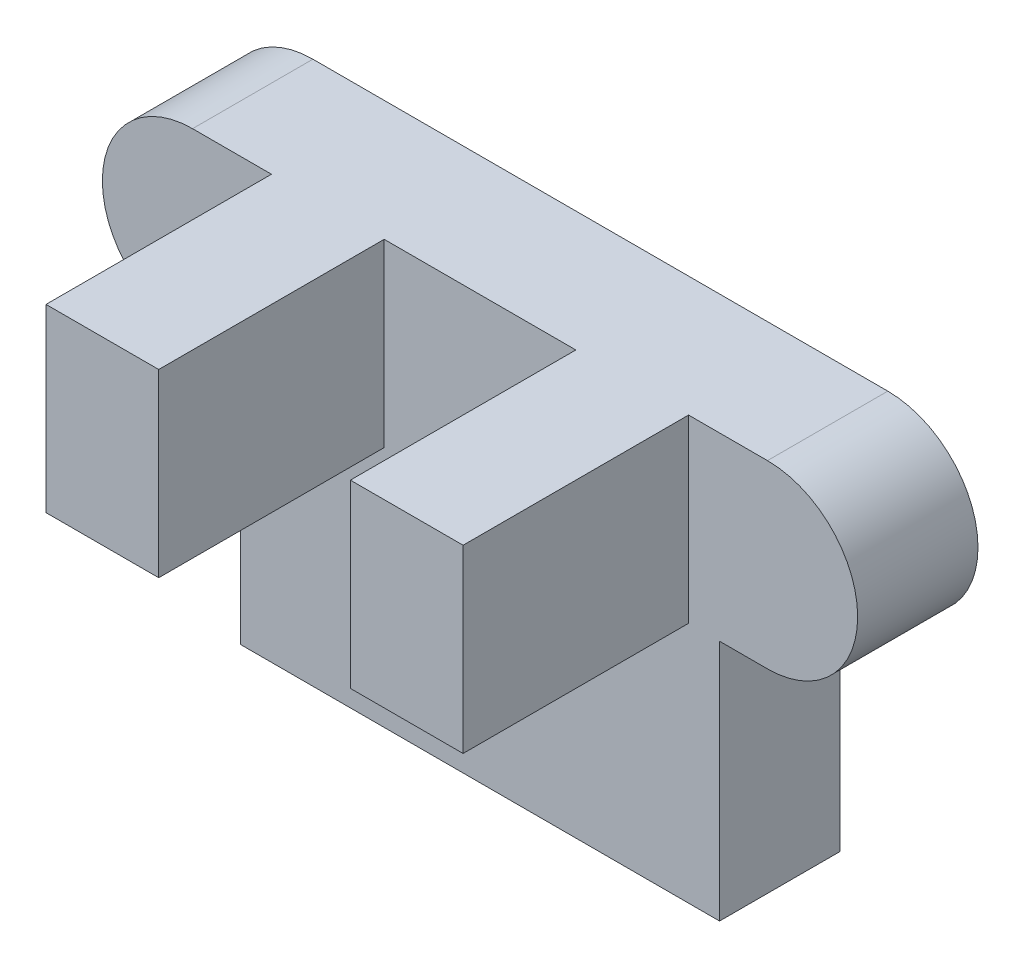
ISO-10303-21;
HEADER;
FILE_DESCRIPTION(('STEP AP214'),'2;1');
FILE_NAME('part.step','',(''),(''),'','','');
FILE_SCHEMA(('AUTOMOTIVE_DESIGN { 1 0 10303 214 1 1 1 1 }'));
ENDSEC;
DATA;
#1=APPLICATION_CONTEXT('core data for automotive mechanical design processes');
#2=APPLICATION_PROTOCOL_DEFINITION('international standard','automotive_design',2000,#1);
#3=PRODUCT_CONTEXT('',#1,'mechanical');
#4=PRODUCT('Part','Part','',(#3));
#5=PRODUCT_RELATED_PRODUCT_CATEGORY('part','',(#4));
#6=PRODUCT_DEFINITION_FORMATION('','',#4);
#7=PRODUCT_DEFINITION_CONTEXT('part definition',#1,'design');
#8=PRODUCT_DEFINITION('design','',#6,#7);
#9=PRODUCT_DEFINITION_SHAPE('','',#8);
#10=(LENGTH_UNIT() NAMED_UNIT(*) SI_UNIT(.MILLI.,.METRE.));
#11=(NAMED_UNIT(*) PLANE_ANGLE_UNIT() SI_UNIT($,.RADIAN.));
#12=(NAMED_UNIT(*) SI_UNIT($,.STERADIAN.) SOLID_ANGLE_UNIT());
#13=UNCERTAINTY_MEASURE_WITH_UNIT(LENGTH_MEASURE(1.E-05),#10,'distance_accuracy_value','');
#14=(GEOMETRIC_REPRESENTATION_CONTEXT(3) GLOBAL_UNCERTAINTY_ASSIGNED_CONTEXT((#13)) GLOBAL_UNIT_ASSIGNED_CONTEXT((#10,
#11,#12)) REPRESENTATION_CONTEXT('',''));
#15=CARTESIAN_POINT('',(0.,0.,0.));
#16=DIRECTION('',(0.,0.,1.));
#17=DIRECTION('',(1.,0.,0.));
#18=AXIS2_PLACEMENT_3D('',#15,#16,#17);
#19=CARTESIAN_POINT('',(0.,0.,4.27));
#20=DIRECTION('',(0.,0.,1.));
#21=DIRECTION('',(1.,0.,0.));
#22=AXIS2_PLACEMENT_3D('',#19,#20,#21);
#23=PLANE('',#22);
#24=DIRECTION('',(-1.,0.,0.));
#25=VECTOR('',#24,1.);
#26=CARTESIAN_POINT('',(0.,3.2,4.27));
#27=LINE('',#26,#25);
#28=CARTESIAN_POINT('',(20.4,3.2,4.27));
#29=VERTEX_POINT('',#28);
#30=CARTESIAN_POINT('',(17.6,3.2,4.27));
#31=VERTEX_POINT('',#30);
#32=EDGE_CURVE('E225',#29,#31,#27,.T.);
#33=ORIENTED_EDGE('',*,*,#32,.T.);
#34=DIRECTION('',(0.,1.,0.));
#35=VECTOR('',#34,1.);
#36=CARTESIAN_POINT('',(17.6,3.2,4.27));
#37=LINE('',#36,#35);
#38=CARTESIAN_POINT('',(17.6,-3.19999999999999,4.27));
#39=VERTEX_POINT('',#38);
#40=EDGE_CURVE('E174',#39,#31,#37,.T.);
#41=ORIENTED_EDGE('',*,*,#40,.F.);
#42=DIRECTION('',(1.,0.,0.));
#43=VECTOR('',#42,1.);
#44=CARTESIAN_POINT('',(17.6,-3.19999999999999,4.27));
#45=LINE('',#44,#43);
#46=CARTESIAN_POINT('',(13.6,-3.2,4.27));
#47=VERTEX_POINT('',#46);
#48=EDGE_CURVE('E170',#47,#39,#45,.T.);
#49=ORIENTED_EDGE('',*,*,#48,.F.);
#50=DIRECTION('',(0.,-1.,0.));
#51=VECTOR('',#50,1.);
#52=CARTESIAN_POINT('',(13.6,3.2,4.27));
#53=LINE('',#52,#51);
#54=CARTESIAN_POINT('',(13.6,3.2,4.27));
#55=VERTEX_POINT('',#54);
#56=EDGE_CURVE('E460',#55,#47,#53,.T.);
#57=ORIENTED_EDGE('',*,*,#56,.F.);
#58=CARTESIAN_POINT('',(6.8,3.2,4.27));
#59=VERTEX_POINT('',#58);
#60=EDGE_CURVE('E228',#55,#59,#27,.T.);
#61=ORIENTED_EDGE('',*,*,#60,.T.);
#62=DIRECTION('',(0.,1.,0.));
#63=VECTOR('',#62,1.);
#64=CARTESIAN_POINT('',(6.8,3.2,4.27));
#65=LINE('',#64,#63);
#66=CARTESIAN_POINT('',(6.8,-3.2,4.27));
#67=VERTEX_POINT('',#66);
#68=EDGE_CURVE('E187',#67,#59,#65,.T.);
#69=ORIENTED_EDGE('',*,*,#68,.F.);
#70=DIRECTION('',(1.,0.,0.));
#71=VECTOR('',#70,1.);
#72=CARTESIAN_POINT('',(2.8,-3.2,4.27));
#73=LINE('',#72,#71);
#74=CARTESIAN_POINT('',(2.8,-3.2,4.27));
#75=VERTEX_POINT('',#74);
#76=EDGE_CURVE('E60',#75,#67,#73,.T.);
#77=ORIENTED_EDGE('',*,*,#76,.F.);
#78=DIRECTION('',(0.,-1.,0.));
#79=VECTOR('',#78,1.);
#80=CARTESIAN_POINT('',(2.8,3.2,4.27));
#81=LINE('',#80,#79);
#82=CARTESIAN_POINT('',(2.8,3.2,4.27));
#83=VERTEX_POINT('',#82);
#84=EDGE_CURVE('E176',#83,#75,#81,.T.);
#85=ORIENTED_EDGE('',*,*,#84,.F.);
#86=CARTESIAN_POINT('',(0.,3.2,4.27));
#87=VERTEX_POINT('',#86);
#88=EDGE_CURVE('E224',#83,#87,#27,.T.);
#89=ORIENTED_EDGE('',*,*,#88,.T.);
#90=CARTESIAN_POINT('',(0.,0.,4.27));
#91=DIRECTION('',(0.,0.,1.));
#92=DIRECTION('',(1.,0.,0.));
#93=AXIS2_PLACEMENT_3D('',#90,#91,#92);
#94=CIRCLE('',#93,3.2);
#95=CARTESIAN_POINT('',(0.,-3.2,4.27));
#96=VERTEX_POINT('',#95);
#97=EDGE_CURVE('E208',#87,#96,#94,.T.);
#98=ORIENTED_EDGE('',*,*,#97,.T.);
#99=DIRECTION('',(1.,0.,0.));
#100=VECTOR('',#99,1.);
#101=CARTESIAN_POINT('',(0.,-3.2,4.27));
#102=LINE('',#101,#100);
#103=CARTESIAN_POINT('',(1.7,-3.2,4.27));
#104=VERTEX_POINT('',#103);
#105=EDGE_CURVE('E211',#96,#104,#102,.T.);
#106=ORIENTED_EDGE('',*,*,#105,.T.);
#107=DIRECTION('',(0.,-1.,0.));
#108=VECTOR('',#107,1.);
#109=CARTESIAN_POINT('',(1.7,-3.2,4.27));
#110=LINE('',#109,#108);
#111=CARTESIAN_POINT('',(1.7,-11.8,4.27));
#112=VERTEX_POINT('',#111);
#113=EDGE_CURVE('E214',#104,#112,#110,.T.);
#114=ORIENTED_EDGE('',*,*,#113,.T.);
#115=DIRECTION('',(1.,0.,0.));
#116=VECTOR('',#115,1.);
#117=CARTESIAN_POINT('',(1.7,-11.8,4.27));
#118=LINE('',#117,#116);
#119=CARTESIAN_POINT('',(18.7,-11.8,4.27));
#120=VERTEX_POINT('',#119);
#121=EDGE_CURVE('E216',#112,#120,#118,.T.);
#122=ORIENTED_EDGE('',*,*,#121,.T.);
#123=DIRECTION('',(0.,1.,0.));
#124=VECTOR('',#123,1.);
#125=CARTESIAN_POINT('',(18.7,-3.2,4.27));
#126=LINE('',#125,#124);
#127=CARTESIAN_POINT('',(18.7,-3.2,4.27));
#128=VERTEX_POINT('',#127);
#129=EDGE_CURVE('E218',#120,#128,#126,.T.);
#130=ORIENTED_EDGE('',*,*,#129,.T.);
#131=DIRECTION('',(1.,0.,0.));
#132=VECTOR('',#131,1.);
#133=CARTESIAN_POINT('',(18.7,-3.2,4.27));
#134=LINE('',#133,#132);
#135=CARTESIAN_POINT('',(20.4,-3.2,4.27));
#136=VERTEX_POINT('',#135);
#137=EDGE_CURVE('E220',#128,#136,#134,.T.);
#138=ORIENTED_EDGE('',*,*,#137,.T.);
#139=CARTESIAN_POINT('',(20.4,0.,4.27));
#140=DIRECTION('',(0.,0.,1.));
#141=DIRECTION('',(1.,0.,0.));
#142=AXIS2_PLACEMENT_3D('',#139,#140,#141);
#143=CIRCLE('',#142,3.2);
#144=EDGE_CURVE('E222',#136,#29,#143,.T.);
#145=ORIENTED_EDGE('',*,*,#144,.T.);
#146=EDGE_LOOP('',(#33,#41,#49,#57,#61,#69,#77,#85,#89,#98,#106,#114,#122,#130,#138,#145));
#147=FACE_BOUND('',#146,.T.);
#148=ADVANCED_FACE('F37',(#147),#23,.T.);
#149=CARTESIAN_POINT('',(0.,0.,4.27));
#150=DIRECTION('',(0.,0.,-1.));
#151=DIRECTION('',(-1.,0.,0.));
#152=AXIS2_PLACEMENT_3D('',#149,#150,#151);
#153=CYLINDRICAL_SURFACE('',#152,3.2);
#154=CARTESIAN_POINT('',(0.,0.,0.));
#155=DIRECTION('',(0.,0.,1.));
#156=DIRECTION('',(1.,0.,0.));
#157=AXIS2_PLACEMENT_3D('',#154,#155,#156);
#158=CIRCLE('',#157,3.2);
#159=CARTESIAN_POINT('',(0.,3.2,0.));
#160=VERTEX_POINT('',#159);
#161=CARTESIAN_POINT('',(0.,-3.2,0.));
#162=VERTEX_POINT('',#161);
#163=EDGE_CURVE('E207',#160,#162,#158,.T.);
#164=ORIENTED_EDGE('',*,*,#163,.T.);
#165=DIRECTION('',(0.,0.,-1.));
#166=VECTOR('',#165,1.);
#167=CARTESIAN_POINT('',(0.,-3.2,4.27));
#168=LINE('',#167,#166);
#169=EDGE_CURVE('E11',#96,#162,#168,.T.);
#170=ORIENTED_EDGE('',*,*,#169,.F.);
#171=ORIENTED_EDGE('',*,*,#97,.F.);
#172=DIRECTION('',(0.,0.,-1.));
#173=VECTOR('',#172,1.);
#174=CARTESIAN_POINT('',(0.,3.2,4.27));
#175=LINE('',#174,#173);
#176=EDGE_CURVE('E227',#87,#160,#175,.T.);
#177=ORIENTED_EDGE('',*,*,#176,.T.);
#178=EDGE_LOOP('',(#164,#170,#171,#177));
#179=FACE_BOUND('',#178,.T.);
#180=ADVANCED_FACE('F39',(#179),#153,.T.);
#181=CARTESIAN_POINT('',(0.,-3.2,4.27));
#182=DIRECTION('',(0.,1.,0.));
#183=DIRECTION('',(-1.,0.,0.));
#184=AXIS2_PLACEMENT_3D('',#181,#182,#183);
#185=PLANE('',#184);
#186=DIRECTION('',(1.,0.,0.));
#187=VECTOR('',#186,1.);
#188=CARTESIAN_POINT('',(0.,-3.2,0.));
#189=LINE('',#188,#187);
#190=CARTESIAN_POINT('',(1.7,-3.2,0.));
#191=VERTEX_POINT('',#190);
#192=EDGE_CURVE('E231',#162,#191,#189,.T.);
#193=ORIENTED_EDGE('',*,*,#192,.T.);
#194=DIRECTION('',(0.,0.,-1.));
#195=VECTOR('',#194,1.);
#196=CARTESIAN_POINT('',(1.7,-3.2,4.27));
#197=LINE('',#196,#195);
#198=EDGE_CURVE('E45',#104,#191,#197,.T.);
#199=ORIENTED_EDGE('',*,*,#198,.F.);
#200=ORIENTED_EDGE('',*,*,#105,.F.);
#201=ORIENTED_EDGE('',*,*,#169,.T.);
#202=EDGE_LOOP('',(#193,#199,#200,#201));
#203=FACE_BOUND('',#202,.T.);
#204=ADVANCED_FACE('F286',(#203),#185,.F.);
#205=CARTESIAN_POINT('',(1.7,-3.2,4.27));
#206=DIRECTION('',(1.,0.,0.));
#207=DIRECTION('',(0.,1.,0.));
#208=AXIS2_PLACEMENT_3D('',#205,#206,#207);
#209=PLANE('',#208);
#210=DIRECTION('',(0.,-1.,0.));
#211=VECTOR('',#210,1.);
#212=CARTESIAN_POINT('',(1.7,-3.2,0.));
#213=LINE('',#212,#211);
#214=CARTESIAN_POINT('',(1.7,-11.8,0.));
#215=VERTEX_POINT('',#214);
#216=EDGE_CURVE('E233',#191,#215,#213,.T.);
#217=ORIENTED_EDGE('',*,*,#216,.T.);
#218=DIRECTION('',(0.,0.,-1.));
#219=VECTOR('',#218,1.);
#220=CARTESIAN_POINT('',(1.7,-11.8,4.27));
#221=LINE('',#220,#219);
#222=EDGE_CURVE('E258',#112,#215,#221,.T.);
#223=ORIENTED_EDGE('',*,*,#222,.F.);
#224=ORIENTED_EDGE('',*,*,#113,.F.);
#225=ORIENTED_EDGE('',*,*,#198,.T.);
#226=EDGE_LOOP('',(#217,#223,#224,#225));
#227=FACE_BOUND('',#226,.T.);
#228=ADVANCED_FACE('F265',(#227),#209,.F.);
#229=CARTESIAN_POINT('',(1.7,-11.8,4.27));
#230=DIRECTION('',(0.,1.,0.));
#231=DIRECTION('',(-1.,0.,0.));
#232=AXIS2_PLACEMENT_3D('',#229,#230,#231);
#233=PLANE('',#232);
#234=DIRECTION('',(1.,0.,0.));
#235=VECTOR('',#234,1.);
#236=CARTESIAN_POINT('',(1.7,-11.8,0.));
#237=LINE('',#236,#235);
#238=CARTESIAN_POINT('',(18.7,-11.8,0.));
#239=VERTEX_POINT('',#238);
#240=EDGE_CURVE('E235',#215,#239,#237,.T.);
#241=ORIENTED_EDGE('',*,*,#240,.T.);
#242=DIRECTION('',(0.,0.,-1.));
#243=VECTOR('',#242,1.);
#244=CARTESIAN_POINT('',(18.7,-11.8,4.27));
#245=LINE('',#244,#243);
#246=EDGE_CURVE('E255',#120,#239,#245,.T.);
#247=ORIENTED_EDGE('',*,*,#246,.F.);
#248=ORIENTED_EDGE('',*,*,#121,.F.);
#249=ORIENTED_EDGE('',*,*,#222,.T.);
#250=EDGE_LOOP('',(#241,#247,#248,#249));
#251=FACE_BOUND('',#250,.T.);
#252=ADVANCED_FACE('F276',(#251),#233,.F.);
#253=CARTESIAN_POINT('',(18.7,-3.2,4.27));
#254=DIRECTION('',(-1.,0.,0.));
#255=DIRECTION('',(0.,-1.,0.));
#256=AXIS2_PLACEMENT_3D('',#253,#254,#255);
#257=PLANE('',#256);
#258=DIRECTION('',(0.,1.,0.));
#259=VECTOR('',#258,1.);
#260=CARTESIAN_POINT('',(18.7,-3.2,0.));
#261=LINE('',#260,#259);
#262=CARTESIAN_POINT('',(18.7,-3.2,0.));
#263=VERTEX_POINT('',#262);
#264=EDGE_CURVE('E237',#239,#263,#261,.T.);
#265=ORIENTED_EDGE('',*,*,#264,.T.);
#266=DIRECTION('',(0.,0.,-1.));
#267=VECTOR('',#266,1.);
#268=CARTESIAN_POINT('',(18.7,-3.2,4.27));
#269=LINE('',#268,#267);
#270=EDGE_CURVE('E252',#128,#263,#269,.T.);
#271=ORIENTED_EDGE('',*,*,#270,.F.);
#272=ORIENTED_EDGE('',*,*,#129,.F.);
#273=ORIENTED_EDGE('',*,*,#246,.T.);
#274=EDGE_LOOP('',(#265,#271,#272,#273));
#275=FACE_BOUND('',#274,.T.);
#276=ADVANCED_FACE('F280',(#275),#257,.F.);
#277=CARTESIAN_POINT('',(18.7,-3.2,4.27));
#278=DIRECTION('',(0.,1.,0.));
#279=DIRECTION('',(0.,0.,1.));
#280=AXIS2_PLACEMENT_3D('',#277,#278,#279);
#281=PLANE('',#280);
#282=DIRECTION('',(1.,0.,0.));
#283=VECTOR('',#282,1.);
#284=CARTESIAN_POINT('',(18.7,-3.2,0.));
#285=LINE('',#284,#283);
#286=CARTESIAN_POINT('',(20.4,-3.2,0.));
#287=VERTEX_POINT('',#286);
#288=EDGE_CURVE('E239',#263,#287,#285,.T.);
#289=ORIENTED_EDGE('',*,*,#288,.T.);
#290=DIRECTION('',(0.,0.,-1.));
#291=VECTOR('',#290,1.);
#292=CARTESIAN_POINT('',(20.4,-3.2,4.27));
#293=LINE('',#292,#291);
#294=EDGE_CURVE('E249',#136,#287,#293,.T.);
#295=ORIENTED_EDGE('',*,*,#294,.F.);
#296=ORIENTED_EDGE('',*,*,#137,.F.);
#297=ORIENTED_EDGE('',*,*,#270,.T.);
#298=EDGE_LOOP('',(#289,#295,#296,#297));
#299=FACE_BOUND('',#298,.T.);
#300=ADVANCED_FACE('F297',(#299),#281,.F.);
#301=CARTESIAN_POINT('',(20.4,0.,4.27));
#302=DIRECTION('',(0.,0.,-1.));
#303=DIRECTION('',(-1.,0.,0.));
#304=AXIS2_PLACEMENT_3D('',#301,#302,#303);
#305=CYLINDRICAL_SURFACE('',#304,3.2);
#306=CARTESIAN_POINT('',(20.4,0.,0.));
#307=DIRECTION('',(0.,0.,1.));
#308=DIRECTION('',(1.,0.,0.));
#309=AXIS2_PLACEMENT_3D('',#306,#307,#308);
#310=CIRCLE('',#309,3.2);
#311=CARTESIAN_POINT('',(20.4,3.2,0.));
#312=VERTEX_POINT('',#311);
#313=EDGE_CURVE('E241',#287,#312,#310,.T.);
#314=ORIENTED_EDGE('',*,*,#313,.T.);
#315=DIRECTION('',(0.,0.,-1.));
#316=VECTOR('',#315,1.);
#317=CARTESIAN_POINT('',(20.4,3.2,4.27));
#318=LINE('',#317,#316);
#319=EDGE_CURVE('E246',#29,#312,#318,.T.);
#320=ORIENTED_EDGE('',*,*,#319,.F.);
#321=ORIENTED_EDGE('',*,*,#144,.F.);
#322=ORIENTED_EDGE('',*,*,#294,.T.);
#323=EDGE_LOOP('',(#314,#320,#321,#322));
#324=FACE_BOUND('',#323,.T.);
#325=ADVANCED_FACE('F295',(#324),#305,.T.);
#326=CARTESIAN_POINT('',(0.,3.2,4.27));
#327=DIRECTION('',(0.,-1.,0.));
#328=DIRECTION('',(0.,0.,-1.));
#329=AXIS2_PLACEMENT_3D('',#326,#327,#328);
#330=PLANE('',#329);
#331=DIRECTION('',(-1.,0.,0.));
#332=VECTOR('',#331,1.);
#333=CARTESIAN_POINT('',(0.,3.2,0.));
#334=LINE('',#333,#332);
#335=EDGE_CURVE('E212',#312,#160,#334,.T.);
#336=ORIENTED_EDGE('',*,*,#335,.T.);
#337=ORIENTED_EDGE('',*,*,#176,.F.);
#338=ORIENTED_EDGE('',*,*,#88,.F.);
#339=DIRECTION('',(0.,0.,-1.));
#340=VECTOR('',#339,1.);
#341=CARTESIAN_POINT('',(2.8,3.2,12.27));
#342=LINE('',#341,#340);
#343=CARTESIAN_POINT('',(2.8,3.2,12.27));
#344=VERTEX_POINT('',#343);
#345=EDGE_CURVE('E192',#344,#83,#342,.T.);
#346=ORIENTED_EDGE('',*,*,#345,.F.);
#347=DIRECTION('',(-1.,0.,0.));
#348=VECTOR('',#347,1.);
#349=CARTESIAN_POINT('',(2.8,3.2,12.27));
#350=LINE('',#349,#348);
#351=CARTESIAN_POINT('',(6.8,3.2,12.27));
#352=VERTEX_POINT('',#351);
#353=EDGE_CURVE('E191',#352,#344,#350,.T.);
#354=ORIENTED_EDGE('',*,*,#353,.F.);
#355=DIRECTION('',(0.,0.,-1.));
#356=VECTOR('',#355,1.);
#357=CARTESIAN_POINT('',(6.8,3.2,12.27));
#358=LINE('',#357,#356);
#359=EDGE_CURVE('E199',#352,#59,#358,.T.);
#360=ORIENTED_EDGE('',*,*,#359,.T.);
#361=ORIENTED_EDGE('',*,*,#60,.F.);
#362=DIRECTION('',(0.,0.,-1.));
#363=VECTOR('',#362,1.);
#364=CARTESIAN_POINT('',(13.6,3.2,12.27));
#365=LINE('',#364,#363);
#366=CARTESIAN_POINT('',(13.6,3.2,12.27));
#367=VERTEX_POINT('',#366);
#368=EDGE_CURVE('E158',#367,#55,#365,.T.);
#369=ORIENTED_EDGE('',*,*,#368,.F.);
#370=DIRECTION('',(-1.,0.,0.));
#371=VECTOR('',#370,1.);
#372=CARTESIAN_POINT('',(17.6,3.2,12.27));
#373=LINE('',#372,#371);
#374=CARTESIAN_POINT('',(17.6,3.2,12.27));
#375=VERTEX_POINT('',#374);
#376=EDGE_CURVE('E150',#375,#367,#373,.T.);
#377=ORIENTED_EDGE('',*,*,#376,.F.);
#378=DIRECTION('',(0.,0.,-1.));
#379=VECTOR('',#378,1.);
#380=CARTESIAN_POINT('',(17.6,3.2,12.27));
#381=LINE('',#380,#379);
#382=EDGE_CURVE('E155',#375,#31,#381,.T.);
#383=ORIENTED_EDGE('',*,*,#382,.T.);
#384=ORIENTED_EDGE('',*,*,#32,.F.);
#385=ORIENTED_EDGE('',*,*,#319,.T.);
#386=EDGE_LOOP('',(#336,#337,#338,#346,#354,#360,#361,#369,#377,#383,#384,#385));
#387=FACE_BOUND('',#386,.T.);
#388=ADVANCED_FACE('F152',(#387),#330,.F.);
#389=CARTESIAN_POINT('',(0.,0.,0.));
#390=DIRECTION('',(0.,0.,1.));
#391=DIRECTION('',(1.,0.,0.));
#392=AXIS2_PLACEMENT_3D('',#389,#390,#391);
#393=PLANE('',#392);
#394=ORIENTED_EDGE('',*,*,#163,.F.);
#395=ORIENTED_EDGE('',*,*,#335,.F.);
#396=ORIENTED_EDGE('',*,*,#313,.F.);
#397=ORIENTED_EDGE('',*,*,#288,.F.);
#398=ORIENTED_EDGE('',*,*,#264,.F.);
#399=ORIENTED_EDGE('',*,*,#240,.F.);
#400=ORIENTED_EDGE('',*,*,#216,.F.);
#401=ORIENTED_EDGE('',*,*,#192,.F.);
#402=EDGE_LOOP('',(#394,#395,#396,#397,#398,#399,#400,#401));
#403=FACE_BOUND('',#402,.T.);
#404=ADVANCED_FACE('F271',(#403),#393,.F.);
#405=CARTESIAN_POINT('',(2.8,3.2,12.27));
#406=DIRECTION('',(1.,0.,0.));
#407=DIRECTION('',(0.,1.,0.));
#408=AXIS2_PLACEMENT_3D('',#405,#406,#407);
#409=PLANE('',#408);
#410=ORIENTED_EDGE('',*,*,#84,.T.);
#411=DIRECTION('',(0.,0.,-1.));
#412=VECTOR('',#411,1.);
#413=CARTESIAN_POINT('',(2.8,-3.2,12.27));
#414=LINE('',#413,#412);
#415=CARTESIAN_POINT('',(2.8,-3.2,12.27));
#416=VERTEX_POINT('',#415);
#417=EDGE_CURVE('E205',#416,#75,#414,.T.);
#418=ORIENTED_EDGE('',*,*,#417,.F.);
#419=DIRECTION('',(0.,-1.,0.));
#420=VECTOR('',#419,1.);
#421=CARTESIAN_POINT('',(2.8,3.2,12.27));
#422=LINE('',#421,#420);
#423=EDGE_CURVE('E183',#344,#416,#422,.T.);
#424=ORIENTED_EDGE('',*,*,#423,.F.);
#425=ORIENTED_EDGE('',*,*,#345,.T.);
#426=EDGE_LOOP('',(#410,#418,#424,#425));
#427=FACE_BOUND('',#426,.T.);
#428=ADVANCED_FACE('F313',(#427),#409,.F.);
#429=CARTESIAN_POINT('',(2.8,-3.2,12.27));
#430=DIRECTION('',(0.,1.,0.));
#431=DIRECTION('',(0.,0.,1.));
#432=AXIS2_PLACEMENT_3D('',#429,#430,#431);
#433=PLANE('',#432);
#434=ORIENTED_EDGE('',*,*,#76,.T.);
#435=DIRECTION('',(0.,0.,-1.));
#436=VECTOR('',#435,1.);
#437=CARTESIAN_POINT('',(6.8,-3.2,12.27));
#438=LINE('',#437,#436);
#439=CARTESIAN_POINT('',(6.8,-3.2,12.27));
#440=VERTEX_POINT('',#439);
#441=EDGE_CURVE('E202',#440,#67,#438,.T.);
#442=ORIENTED_EDGE('',*,*,#441,.F.);
#443=DIRECTION('',(1.,0.,0.));
#444=VECTOR('',#443,1.);
#445=CARTESIAN_POINT('',(2.8,-3.2,12.27));
#446=LINE('',#445,#444);
#447=EDGE_CURVE('E186',#416,#440,#446,.T.);
#448=ORIENTED_EDGE('',*,*,#447,.F.);
#449=ORIENTED_EDGE('',*,*,#417,.T.);
#450=EDGE_LOOP('',(#434,#442,#448,#449));
#451=FACE_BOUND('',#450,.T.);
#452=ADVANCED_FACE('F332',(#451),#433,.F.);
#453=CARTESIAN_POINT('',(6.8,3.2,12.27));
#454=DIRECTION('',(-1.,0.,0.));
#455=DIRECTION('',(0.,0.,1.));
#456=AXIS2_PLACEMENT_3D('',#453,#454,#455);
#457=PLANE('',#456);
#458=ORIENTED_EDGE('',*,*,#68,.T.);
#459=ORIENTED_EDGE('',*,*,#359,.F.);
#460=DIRECTION('',(0.,1.,0.));
#461=VECTOR('',#460,1.);
#462=CARTESIAN_POINT('',(6.8,3.2,12.27));
#463=LINE('',#462,#461);
#464=EDGE_CURVE('E189',#440,#352,#463,.T.);
#465=ORIENTED_EDGE('',*,*,#464,.F.);
#466=ORIENTED_EDGE('',*,*,#441,.T.);
#467=EDGE_LOOP('',(#458,#459,#465,#466));
#468=FACE_BOUND('',#467,.T.);
#469=ADVANCED_FACE('F339',(#468),#457,.F.);
#470=CARTESIAN_POINT('',(0.,0.,12.27));
#471=DIRECTION('',(0.,0.,1.));
#472=DIRECTION('',(1.,0.,0.));
#473=AXIS2_PLACEMENT_3D('',#470,#471,#472);
#474=PLANE('',#473);
#475=ORIENTED_EDGE('',*,*,#423,.T.);
#476=ORIENTED_EDGE('',*,*,#447,.T.);
#477=ORIENTED_EDGE('',*,*,#464,.T.);
#478=ORIENTED_EDGE('',*,*,#353,.T.);
#479=EDGE_LOOP('',(#475,#476,#477,#478));
#480=FACE_BOUND('',#479,.T.);
#481=ADVANCED_FACE('F346',(#480),#474,.T.);
#482=CARTESIAN_POINT('',(17.6,3.2,12.27));
#483=DIRECTION('',(-1.,0.,0.));
#484=DIRECTION('',(0.,-1.,0.));
#485=AXIS2_PLACEMENT_3D('',#482,#483,#484);
#486=PLANE('',#485);
#487=ORIENTED_EDGE('',*,*,#40,.T.);
#488=ORIENTED_EDGE('',*,*,#382,.F.);
#489=DIRECTION('',(0.,1.,0.));
#490=VECTOR('',#489,1.);
#491=CARTESIAN_POINT('',(17.6,3.2,12.27));
#492=LINE('',#491,#490);
#493=CARTESIAN_POINT('',(17.6,-3.19999999999999,12.27));
#494=VERTEX_POINT('',#493);
#495=EDGE_CURVE('E162',#494,#375,#492,.T.);
#496=ORIENTED_EDGE('',*,*,#495,.F.);
#497=DIRECTION('',(0.,0.,-1.));
#498=VECTOR('',#497,1.);
#499=CARTESIAN_POINT('',(17.6,-3.19999999999999,12.27));
#500=LINE('',#499,#498);
#501=EDGE_CURVE('E458',#494,#39,#500,.T.);
#502=ORIENTED_EDGE('',*,*,#501,.T.);
#503=EDGE_LOOP('',(#487,#488,#496,#502));
#504=FACE_BOUND('',#503,.T.);
#505=ADVANCED_FACE('F172',(#504),#486,.F.);
#506=CARTESIAN_POINT('',(13.6,3.2,12.27));
#507=DIRECTION('',(1.,0.,0.));
#508=DIRECTION('',(0.,1.,0.));
#509=AXIS2_PLACEMENT_3D('',#506,#507,#508);
#510=PLANE('',#509);
#511=ORIENTED_EDGE('',*,*,#56,.T.);
#512=DIRECTION('',(0.,0.,-1.));
#513=VECTOR('',#512,1.);
#514=CARTESIAN_POINT('',(13.6,-3.2,12.27));
#515=LINE('',#514,#513);
#516=CARTESIAN_POINT('',(13.6,-3.2,12.27));
#517=VERTEX_POINT('',#516);
#518=EDGE_CURVE('E52',#517,#47,#515,.T.);
#519=ORIENTED_EDGE('',*,*,#518,.F.);
#520=DIRECTION('',(0.,-1.,0.));
#521=VECTOR('',#520,1.);
#522=CARTESIAN_POINT('',(13.6,3.2,12.27));
#523=LINE('',#522,#521);
#524=EDGE_CURVE('E161',#367,#517,#523,.T.);
#525=ORIENTED_EDGE('',*,*,#524,.F.);
#526=ORIENTED_EDGE('',*,*,#368,.T.);
#527=EDGE_LOOP('',(#511,#519,#525,#526));
#528=FACE_BOUND('',#527,.T.);
#529=ADVANCED_FACE('F361',(#528),#510,.F.);
#530=CARTESIAN_POINT('',(17.6,-3.19999999999999,12.27));
#531=DIRECTION('',(0.,1.,0.));
#532=DIRECTION('',(-1.,0.,0.));
#533=AXIS2_PLACEMENT_3D('',#530,#531,#532);
#534=PLANE('',#533);
#535=ORIENTED_EDGE('',*,*,#48,.T.);
#536=ORIENTED_EDGE('',*,*,#501,.F.);
#537=DIRECTION('',(1.,0.,0.));
#538=VECTOR('',#537,1.);
#539=CARTESIAN_POINT('',(17.6,-3.19999999999999,12.27));
#540=LINE('',#539,#538);
#541=EDGE_CURVE('E166',#517,#494,#540,.T.);
#542=ORIENTED_EDGE('',*,*,#541,.F.);
#543=ORIENTED_EDGE('',*,*,#518,.T.);
#544=EDGE_LOOP('',(#535,#536,#542,#543));
#545=FACE_BOUND('',#544,.T.);
#546=ADVANCED_FACE('F368',(#545),#534,.F.);
#547=CARTESIAN_POINT('',(0.,0.,12.27));
#548=DIRECTION('',(0.,0.,-1.));
#549=DIRECTION('',(-1.,0.,0.));
#550=AXIS2_PLACEMENT_3D('',#547,#548,#549);
#551=PLANE('',#550);
#552=ORIENTED_EDGE('',*,*,#495,.T.);
#553=ORIENTED_EDGE('',*,*,#376,.T.);
#554=ORIENTED_EDGE('',*,*,#524,.T.);
#555=ORIENTED_EDGE('',*,*,#541,.T.);
#556=EDGE_LOOP('',(#552,#553,#554,#555));
#557=FACE_BOUND('',#556,.T.);
#558=ADVANCED_FACE('F165',(#557),#551,.F.);
#559=CLOSED_SHELL('',(#148,#180,#204,#228,#252,#276,#300,#325,#388,#404,#428,#452,#469,#481,
#505,#529,#546,#558));
#560=MANIFOLD_SOLID_BREP('B2',#559);
#561=ADVANCED_BREP_SHAPE_REPRESENTATION('',(#18,#560),#14);
#562=SHAPE_DEFINITION_REPRESENTATION(#9,#561);
ENDSEC;
END-ISO-10303-21;
